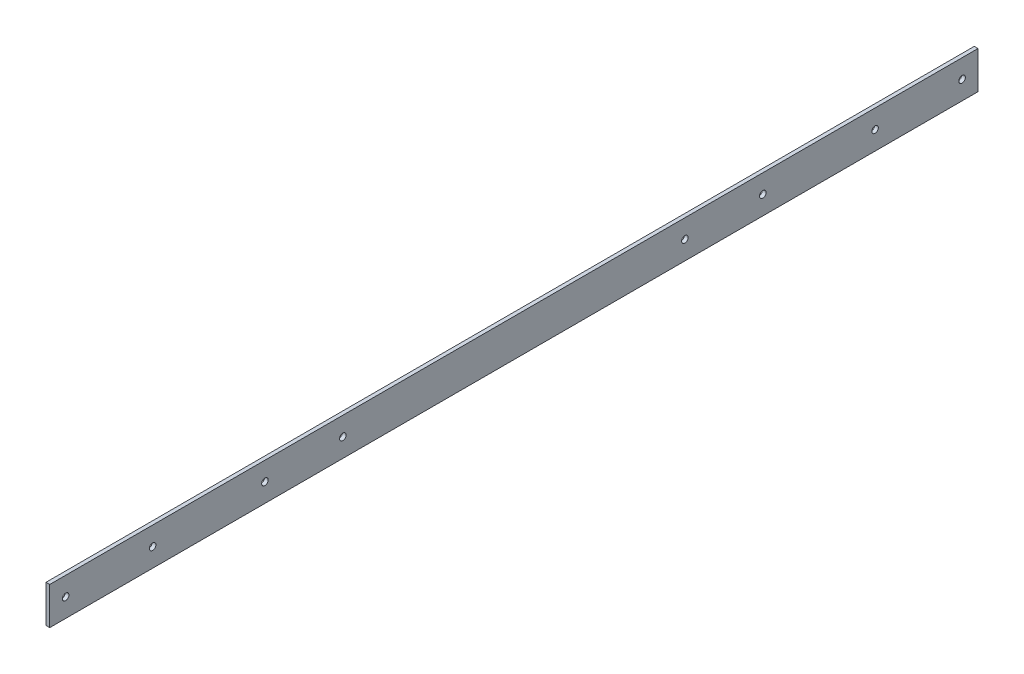
ISO-10303-21;
HEADER;
FILE_DESCRIPTION(('STEP AP214'),'2;1');
FILE_NAME('part.step','',(''),(''),'','','');
FILE_SCHEMA(('AUTOMOTIVE_DESIGN { 1 0 10303 214 1 1 1 1 }'));
ENDSEC;
DATA;
#1=APPLICATION_CONTEXT('core data for automotive mechanical design processes');
#2=APPLICATION_PROTOCOL_DEFINITION('international standard','automotive_design',2000,#1);
#3=PRODUCT_CONTEXT('',#1,'mechanical');
#4=PRODUCT('Part','Part','',(#3));
#5=PRODUCT_RELATED_PRODUCT_CATEGORY('part','',(#4));
#6=PRODUCT_DEFINITION_FORMATION('','',#4);
#7=PRODUCT_DEFINITION_CONTEXT('part definition',#1,'design');
#8=PRODUCT_DEFINITION('design','',#6,#7);
#9=PRODUCT_DEFINITION_SHAPE('','',#8);
#10=(LENGTH_UNIT() NAMED_UNIT(*) SI_UNIT(.MILLI.,.METRE.));
#11=(NAMED_UNIT(*) PLANE_ANGLE_UNIT() SI_UNIT($,.RADIAN.));
#12=(NAMED_UNIT(*) SI_UNIT($,.STERADIAN.) SOLID_ANGLE_UNIT());
#13=UNCERTAINTY_MEASURE_WITH_UNIT(LENGTH_MEASURE(1.E-05),#10,'distance_accuracy_value','');
#14=(GEOMETRIC_REPRESENTATION_CONTEXT(3) GLOBAL_UNCERTAINTY_ASSIGNED_CONTEXT((#13)) GLOBAL_UNIT_ASSIGNED_CONTEXT((#10,
#11,#12)) REPRESENTATION_CONTEXT('',''));
#15=CARTESIAN_POINT('',(0.,0.,0.));
#16=DIRECTION('',(0.,0.,1.));
#17=DIRECTION('',(1.,0.,0.));
#18=AXIS2_PLACEMENT_3D('',#15,#16,#17);
#19=CARTESIAN_POINT('',(0.,0.,496.));
#20=DIRECTION('',(1.,0.,0.));
#21=DIRECTION('',(0.,0.,-1.));
#22=AXIS2_PLACEMENT_3D('',#19,#20,#21);
#23=PLANE('',#22);
#24=CARTESIAN_POINT('',(0.,10.,55.));
#25=DIRECTION('',(-1.,0.,0.));
#26=DIRECTION('',(0.,0.,1.));
#27=AXIS2_PLACEMENT_3D('',#24,#25,#26);
#28=CIRCLE('',#27,1.74999999999998);
#29=CARTESIAN_POINT('',(0.,10.,56.75));
#30=VERTEX_POINT('',#29);
#31=EDGE_CURVE('E139',#30,#30,#28,.T.);
#32=ORIENTED_EDGE('',*,*,#31,.F.);
#33=EDGE_LOOP('',(#32));
#34=FACE_BOUND('',#33,.T.);
#35=CARTESIAN_POINT('',(0.,10.,114.99));
#36=DIRECTION('',(-1.,0.,0.));
#37=DIRECTION('',(0.,0.,1.));
#38=AXIS2_PLACEMENT_3D('',#35,#36,#37);
#39=CIRCLE('',#38,1.74999999999998);
#40=CARTESIAN_POINT('',(0.,10.,116.74));
#41=VERTEX_POINT('',#40);
#42=EDGE_CURVE('E151',#41,#41,#39,.T.);
#43=ORIENTED_EDGE('',*,*,#42,.F.);
#44=EDGE_LOOP('',(#43));
#45=FACE_BOUND('',#44,.T.);
#46=CARTESIAN_POINT('',(0.,10.,156.6));
#47=DIRECTION('',(-1.,0.,0.));
#48=DIRECTION('',(0.,0.,1.));
#49=AXIS2_PLACEMENT_3D('',#46,#47,#48);
#50=CIRCLE('',#49,1.74999999999998);
#51=CARTESIAN_POINT('',(0.,10.,158.35));
#52=VERTEX_POINT('',#51);
#53=EDGE_CURVE('E145',#52,#52,#50,.T.);
#54=ORIENTED_EDGE('',*,*,#53,.F.);
#55=EDGE_LOOP('',(#54));
#56=FACE_BOUND('',#55,.T.);
#57=CARTESIAN_POINT('',(0.,10.,8.50000000000001));
#58=DIRECTION('',(-1.,0.,0.));
#59=DIRECTION('',(0.,0.,1.));
#60=AXIS2_PLACEMENT_3D('',#57,#58,#59);
#61=CIRCLE('',#60,1.74999999999998);
#62=CARTESIAN_POINT('',(0.,10.,10.25));
#63=VERTEX_POINT('',#62);
#64=EDGE_CURVE('E122',#63,#63,#61,.T.);
#65=ORIENTED_EDGE('',*,*,#64,.F.);
#66=EDGE_LOOP('',(#65));
#67=FACE_BOUND('',#66,.T.);
#68=CARTESIAN_POINT('',(0.,10.,441.));
#69=DIRECTION('',(1.,0.,0.));
#70=DIRECTION('',(0.,0.,-1.));
#71=AXIS2_PLACEMENT_3D('',#68,#69,#70);
#72=CIRCLE('',#71,1.74999999999998);
#73=CARTESIAN_POINT('',(0.,10.,439.25));
#74=VERTEX_POINT('',#73);
#75=EDGE_CURVE('E115',#74,#74,#72,.T.);
#76=ORIENTED_EDGE('',*,*,#75,.T.);
#77=EDGE_LOOP('',(#76));
#78=FACE_BOUND('',#77,.T.);
#79=CARTESIAN_POINT('',(0.,10.,381.01));
#80=DIRECTION('',(1.,0.,0.));
#81=DIRECTION('',(0.,0.,-1.));
#82=AXIS2_PLACEMENT_3D('',#79,#80,#81);
#83=CIRCLE('',#82,1.74999999999998);
#84=CARTESIAN_POINT('',(0.,10.,379.26));
#85=VERTEX_POINT('',#84);
#86=EDGE_CURVE('E128',#85,#85,#83,.T.);
#87=ORIENTED_EDGE('',*,*,#86,.T.);
#88=EDGE_LOOP('',(#87));
#89=FACE_BOUND('',#88,.T.);
#90=CARTESIAN_POINT('',(0.,10.,339.4));
#91=DIRECTION('',(1.,0.,0.));
#92=DIRECTION('',(0.,0.,-1.));
#93=AXIS2_PLACEMENT_3D('',#90,#91,#92);
#94=CIRCLE('',#93,1.74999999999998);
#95=CARTESIAN_POINT('',(0.,10.,337.65));
#96=VERTEX_POINT('',#95);
#97=EDGE_CURVE('E121',#96,#96,#94,.T.);
#98=ORIENTED_EDGE('',*,*,#97,.T.);
#99=EDGE_LOOP('',(#98));
#100=FACE_BOUND('',#99,.T.);
#101=CARTESIAN_POINT('',(0.,10.,487.5));
#102=DIRECTION('',(1.,0.,0.));
#103=DIRECTION('',(0.,0.,-1.));
#104=AXIS2_PLACEMENT_3D('',#101,#102,#103);
#105=CIRCLE('',#104,1.74999999999998);
#106=CARTESIAN_POINT('',(0.,10.,485.75));
#107=VERTEX_POINT('',#106);
#108=EDGE_CURVE('E101',#107,#107,#105,.T.);
#109=ORIENTED_EDGE('',*,*,#108,.T.);
#110=EDGE_LOOP('',(#109));
#111=FACE_BOUND('',#110,.T.);
#112=DIRECTION('',(0.,-1.,0.));
#113=VECTOR('',#112,1.);
#114=CARTESIAN_POINT('',(0.,0.,0.));
#115=LINE('',#114,#113);
#116=CARTESIAN_POINT('',(0.,20.,0.));
#117=VERTEX_POINT('',#116);
#118=CARTESIAN_POINT('',(0.,0.,0.));
#119=VERTEX_POINT('',#118);
#120=EDGE_CURVE('E98',#117,#119,#115,.T.);
#121=ORIENTED_EDGE('',*,*,#120,.T.);
#122=DIRECTION('',(0.,0.,-1.));
#123=VECTOR('',#122,1.);
#124=CARTESIAN_POINT('',(0.,0.,496.));
#125=LINE('',#124,#123);
#126=CARTESIAN_POINT('',(0.,0.,496.));
#127=VERTEX_POINT('',#126);
#128=EDGE_CURVE('E11',#127,#119,#125,.T.);
#129=ORIENTED_EDGE('',*,*,#128,.F.);
#130=DIRECTION('',(0.,-1.,0.));
#131=VECTOR('',#130,1.);
#132=CARTESIAN_POINT('',(0.,0.,496.));
#133=LINE('',#132,#131);
#134=CARTESIAN_POINT('',(0.,20.,496.));
#135=VERTEX_POINT('',#134);
#136=EDGE_CURVE('E86',#135,#127,#133,.T.);
#137=ORIENTED_EDGE('',*,*,#136,.F.);
#138=DIRECTION('',(0.,0.,-1.));
#139=VECTOR('',#138,1.);
#140=CARTESIAN_POINT('',(0.,20.,496.));
#141=LINE('',#140,#139);
#142=EDGE_CURVE('E94',#135,#117,#141,.T.);
#143=ORIENTED_EDGE('',*,*,#142,.T.);
#144=EDGE_LOOP('',(#121,#129,#137,#143));
#145=FACE_BOUND('',#144,.T.);
#146=ADVANCED_FACE('F35',(#34,#45,#56,#67,#78,#89,#100,#111,#145),#23,.F.);
#147=CARTESIAN_POINT('',(0.,0.,496.));
#148=DIRECTION('',(0.,1.,0.));
#149=DIRECTION('',(0.,0.,1.));
#150=AXIS2_PLACEMENT_3D('',#147,#148,#149);
#151=PLANE('',#150);
#152=DIRECTION('',(1.,0.,0.));
#153=VECTOR('',#152,1.);
#154=CARTESIAN_POINT('',(0.,0.,0.));
#155=LINE('',#154,#153);
#156=CARTESIAN_POINT('',(2.,0.,0.));
#157=VERTEX_POINT('',#156);
#158=EDGE_CURVE('E90',#119,#157,#155,.T.);
#159=ORIENTED_EDGE('',*,*,#158,.T.);
#160=DIRECTION('',(0.,0.,-1.));
#161=VECTOR('',#160,1.);
#162=CARTESIAN_POINT('',(2.,0.,496.));
#163=LINE('',#162,#161);
#164=CARTESIAN_POINT('',(2.,0.,496.));
#165=VERTEX_POINT('',#164);
#166=EDGE_CURVE('E43',#165,#157,#163,.T.);
#167=ORIENTED_EDGE('',*,*,#166,.F.);
#168=DIRECTION('',(1.,0.,0.));
#169=VECTOR('',#168,1.);
#170=CARTESIAN_POINT('',(0.,0.,496.));
#171=LINE('',#170,#169);
#172=EDGE_CURVE('E81',#127,#165,#171,.T.);
#173=ORIENTED_EDGE('',*,*,#172,.F.);
#174=ORIENTED_EDGE('',*,*,#128,.T.);
#175=EDGE_LOOP('',(#159,#167,#173,#174));
#176=FACE_BOUND('',#175,.T.);
#177=ADVANCED_FACE('F89',(#176),#151,.F.);
#178=CARTESIAN_POINT('',(2.,0.,496.));
#179=DIRECTION('',(-1.,0.,0.));
#180=DIRECTION('',(0.,0.,1.));
#181=AXIS2_PLACEMENT_3D('',#178,#179,#180);
#182=PLANE('',#181);
#183=CARTESIAN_POINT('',(2.,10.,55.));
#184=DIRECTION('',(-1.,0.,0.));
#185=DIRECTION('',(0.,0.,1.));
#186=AXIS2_PLACEMENT_3D('',#183,#184,#185);
#187=CIRCLE('',#186,1.74999999999998);
#188=CARTESIAN_POINT('',(2.,10.,56.75));
#189=VERTEX_POINT('',#188);
#190=EDGE_CURVE('E154',#189,#189,#187,.T.);
#191=ORIENTED_EDGE('',*,*,#190,.T.);
#192=EDGE_LOOP('',(#191));
#193=FACE_BOUND('',#192,.T.);
#194=CARTESIAN_POINT('',(2.,10.,114.99));
#195=DIRECTION('',(-1.,0.,0.));
#196=DIRECTION('',(0.,0.,1.));
#197=AXIS2_PLACEMENT_3D('',#194,#195,#196);
#198=CIRCLE('',#197,1.74999999999998);
#199=CARTESIAN_POINT('',(2.,10.,116.74));
#200=VERTEX_POINT('',#199);
#201=EDGE_CURVE('E148',#200,#200,#198,.T.);
#202=ORIENTED_EDGE('',*,*,#201,.T.);
#203=EDGE_LOOP('',(#202));
#204=FACE_BOUND('',#203,.T.);
#205=CARTESIAN_POINT('',(2.,10.,156.6));
#206=DIRECTION('',(-1.,0.,0.));
#207=DIRECTION('',(0.,0.,1.));
#208=AXIS2_PLACEMENT_3D('',#205,#206,#207);
#209=CIRCLE('',#208,1.74999999999998);
#210=CARTESIAN_POINT('',(2.,10.,158.35));
#211=VERTEX_POINT('',#210);
#212=EDGE_CURVE('E142',#211,#211,#209,.T.);
#213=ORIENTED_EDGE('',*,*,#212,.T.);
#214=EDGE_LOOP('',(#213));
#215=FACE_BOUND('',#214,.T.);
#216=CARTESIAN_POINT('',(2.,10.,8.50000000000001));
#217=DIRECTION('',(-1.,0.,0.));
#218=DIRECTION('',(0.,0.,1.));
#219=AXIS2_PLACEMENT_3D('',#216,#217,#218);
#220=CIRCLE('',#219,1.74999999999998);
#221=CARTESIAN_POINT('',(2.,10.,10.25));
#222=VERTEX_POINT('',#221);
#223=EDGE_CURVE('E136',#222,#222,#220,.T.);
#224=ORIENTED_EDGE('',*,*,#223,.T.);
#225=EDGE_LOOP('',(#224));
#226=FACE_BOUND('',#225,.T.);
#227=CARTESIAN_POINT('',(2.,10.,441.));
#228=DIRECTION('',(1.,0.,0.));
#229=DIRECTION('',(0.,0.,-1.));
#230=AXIS2_PLACEMENT_3D('',#227,#228,#229);
#231=CIRCLE('',#230,1.74999999999998);
#232=CARTESIAN_POINT('',(2.,10.,439.25));
#233=VERTEX_POINT('',#232);
#234=EDGE_CURVE('E131',#233,#233,#231,.T.);
#235=ORIENTED_EDGE('',*,*,#234,.F.);
#236=EDGE_LOOP('',(#235));
#237=FACE_BOUND('',#236,.T.);
#238=CARTESIAN_POINT('',(2.,10.,381.01));
#239=DIRECTION('',(1.,0.,0.));
#240=DIRECTION('',(0.,0.,-1.));
#241=AXIS2_PLACEMENT_3D('',#238,#239,#240);
#242=CIRCLE('',#241,1.74999999999998);
#243=CARTESIAN_POINT('',(2.,10.,379.26));
#244=VERTEX_POINT('',#243);
#245=EDGE_CURVE('E125',#244,#244,#242,.T.);
#246=ORIENTED_EDGE('',*,*,#245,.F.);
#247=EDGE_LOOP('',(#246));
#248=FACE_BOUND('',#247,.T.);
#249=CARTESIAN_POINT('',(2.,10.,339.4));
#250=DIRECTION('',(1.,0.,0.));
#251=DIRECTION('',(0.,0.,-1.));
#252=AXIS2_PLACEMENT_3D('',#249,#250,#251);
#253=CIRCLE('',#252,1.74999999999998);
#254=CARTESIAN_POINT('',(2.,10.,337.65));
#255=VERTEX_POINT('',#254);
#256=EDGE_CURVE('E118',#255,#255,#253,.T.);
#257=ORIENTED_EDGE('',*,*,#256,.F.);
#258=EDGE_LOOP('',(#257));
#259=FACE_BOUND('',#258,.T.);
#260=CARTESIAN_POINT('',(2.,10.,487.5));
#261=DIRECTION('',(1.,0.,0.));
#262=DIRECTION('',(0.,0.,-1.));
#263=AXIS2_PLACEMENT_3D('',#260,#261,#262);
#264=CIRCLE('',#263,1.74999999999998);
#265=CARTESIAN_POINT('',(2.,10.,485.75));
#266=VERTEX_POINT('',#265);
#267=EDGE_CURVE('E112',#266,#266,#264,.T.);
#268=ORIENTED_EDGE('',*,*,#267,.F.);
#269=EDGE_LOOP('',(#268));
#270=FACE_BOUND('',#269,.T.);
#271=DIRECTION('',(0.,1.,0.));
#272=VECTOR('',#271,1.);
#273=CARTESIAN_POINT('',(2.,0.,0.));
#274=LINE('',#273,#272);
#275=CARTESIAN_POINT('',(2.,20.,0.));
#276=VERTEX_POINT('',#275);
#277=EDGE_CURVE('E68',#157,#276,#274,.T.);
#278=ORIENTED_EDGE('',*,*,#277,.T.);
#279=DIRECTION('',(0.,0.,-1.));
#280=VECTOR('',#279,1.);
#281=CARTESIAN_POINT('',(2.,20.,496.));
#282=LINE('',#281,#280);
#283=CARTESIAN_POINT('',(2.,20.,496.));
#284=VERTEX_POINT('',#283);
#285=EDGE_CURVE('E91',#284,#276,#282,.T.);
#286=ORIENTED_EDGE('',*,*,#285,.F.);
#287=DIRECTION('',(0.,1.,0.));
#288=VECTOR('',#287,1.);
#289=CARTESIAN_POINT('',(2.,0.,496.));
#290=LINE('',#289,#288);
#291=EDGE_CURVE('E84',#165,#284,#290,.T.);
#292=ORIENTED_EDGE('',*,*,#291,.F.);
#293=ORIENTED_EDGE('',*,*,#166,.T.);
#294=EDGE_LOOP('',(#278,#286,#292,#293));
#295=FACE_BOUND('',#294,.T.);
#296=ADVANCED_FACE('F92',(#193,#204,#215,#226,#237,#248,#259,#270,#295),#182,.F.);
#297=CARTESIAN_POINT('',(0.,20.,496.));
#298=DIRECTION('',(0.,-1.,0.));
#299=DIRECTION('',(0.,0.,-1.));
#300=AXIS2_PLACEMENT_3D('',#297,#298,#299);
#301=PLANE('',#300);
#302=DIRECTION('',(-1.,0.,0.));
#303=VECTOR('',#302,1.);
#304=CARTESIAN_POINT('',(0.,20.,0.));
#305=LINE('',#304,#303);
#306=EDGE_CURVE('E74',#276,#117,#305,.T.);
#307=ORIENTED_EDGE('',*,*,#306,.T.);
#308=ORIENTED_EDGE('',*,*,#142,.F.);
#309=DIRECTION('',(-1.,0.,0.));
#310=VECTOR('',#309,1.);
#311=CARTESIAN_POINT('',(0.,20.,496.));
#312=LINE('',#311,#310);
#313=EDGE_CURVE('E51',#284,#135,#312,.T.);
#314=ORIENTED_EDGE('',*,*,#313,.F.);
#315=ORIENTED_EDGE('',*,*,#285,.T.);
#316=EDGE_LOOP('',(#307,#308,#314,#315));
#317=FACE_BOUND('',#316,.T.);
#318=ADVANCED_FACE('F106',(#317),#301,.F.);
#319=CARTESIAN_POINT('',(0.,0.,496.));
#320=DIRECTION('',(0.,0.,-1.));
#321=DIRECTION('',(-1.,0.,0.));
#322=AXIS2_PLACEMENT_3D('',#319,#320,#321);
#323=PLANE('',#322);
#324=ORIENTED_EDGE('',*,*,#136,.T.);
#325=ORIENTED_EDGE('',*,*,#172,.T.);
#326=ORIENTED_EDGE('',*,*,#291,.T.);
#327=ORIENTED_EDGE('',*,*,#313,.T.);
#328=EDGE_LOOP('',(#324,#325,#326,#327));
#329=FACE_BOUND('',#328,.T.);
#330=ADVANCED_FACE('F82',(#329),#323,.F.);
#331=CARTESIAN_POINT('',(0.,0.,0.));
#332=DIRECTION('',(0.,0.,-1.));
#333=DIRECTION('',(-1.,0.,0.));
#334=AXIS2_PLACEMENT_3D('',#331,#332,#333);
#335=PLANE('',#334);
#336=ORIENTED_EDGE('',*,*,#120,.F.);
#337=ORIENTED_EDGE('',*,*,#306,.F.);
#338=ORIENTED_EDGE('',*,*,#277,.F.);
#339=ORIENTED_EDGE('',*,*,#158,.F.);
#340=EDGE_LOOP('',(#336,#337,#338,#339));
#341=FACE_BOUND('',#340,.T.);
#342=ADVANCED_FACE('F109',(#341),#335,.T.);
#343=CARTESIAN_POINT('',(0.,10.,487.5));
#344=DIRECTION('',(1.,0.,0.));
#345=DIRECTION('',(0.,0.,-1.));
#346=AXIS2_PLACEMENT_3D('',#343,#344,#345);
#347=CYLINDRICAL_SURFACE('',#346,1.74999999999998);
#348=ORIENTED_EDGE('',*,*,#108,.F.);
#349=EDGE_LOOP('',(#348));
#350=FACE_BOUND('',#349,.T.);
#351=ORIENTED_EDGE('',*,*,#267,.T.);
#352=EDGE_LOOP('',(#351));
#353=FACE_BOUND('',#352,.T.);
#354=ADVANCED_FACE('F179',(#350,#353),#347,.F.);
#355=CARTESIAN_POINT('',(0.,10.,339.4));
#356=DIRECTION('',(1.,0.,0.));
#357=DIRECTION('',(0.,0.,-1.));
#358=AXIS2_PLACEMENT_3D('',#355,#356,#357);
#359=CYLINDRICAL_SURFACE('',#358,1.74999999999998);
#360=ORIENTED_EDGE('',*,*,#97,.F.);
#361=EDGE_LOOP('',(#360));
#362=FACE_BOUND('',#361,.T.);
#363=ORIENTED_EDGE('',*,*,#256,.T.);
#364=EDGE_LOOP('',(#363));
#365=FACE_BOUND('',#364,.T.);
#366=ADVANCED_FACE('F182',(#362,#365),#359,.F.);
#367=CARTESIAN_POINT('',(0.,10.,381.01));
#368=DIRECTION('',(1.,0.,0.));
#369=DIRECTION('',(0.,0.,-1.));
#370=AXIS2_PLACEMENT_3D('',#367,#368,#369);
#371=CYLINDRICAL_SURFACE('',#370,1.74999999999998);
#372=ORIENTED_EDGE('',*,*,#86,.F.);
#373=EDGE_LOOP('',(#372));
#374=FACE_BOUND('',#373,.T.);
#375=ORIENTED_EDGE('',*,*,#245,.T.);
#376=EDGE_LOOP('',(#375));
#377=FACE_BOUND('',#376,.T.);
#378=ADVANCED_FACE('F202',(#374,#377),#371,.F.);
#379=CARTESIAN_POINT('',(0.,10.,441.));
#380=DIRECTION('',(1.,0.,0.));
#381=DIRECTION('',(0.,0.,-1.));
#382=AXIS2_PLACEMENT_3D('',#379,#380,#381);
#383=CYLINDRICAL_SURFACE('',#382,1.74999999999998);
#384=ORIENTED_EDGE('',*,*,#75,.F.);
#385=EDGE_LOOP('',(#384));
#386=FACE_BOUND('',#385,.T.);
#387=ORIENTED_EDGE('',*,*,#234,.T.);
#388=EDGE_LOOP('',(#387));
#389=FACE_BOUND('',#388,.T.);
#390=ADVANCED_FACE('F206',(#386,#389),#383,.F.);
#391=CARTESIAN_POINT('',(0.,10.,8.50000000000001));
#392=DIRECTION('',(1.,0.,0.));
#393=DIRECTION('',(0.,0.,-1.));
#394=AXIS2_PLACEMENT_3D('',#391,#392,#393);
#395=CYLINDRICAL_SURFACE('',#394,1.74999999999998);
#396=ORIENTED_EDGE('',*,*,#64,.T.);
#397=EDGE_LOOP('',(#396));
#398=FACE_BOUND('',#397,.T.);
#399=ORIENTED_EDGE('',*,*,#223,.F.);
#400=EDGE_LOOP('',(#399));
#401=FACE_BOUND('',#400,.T.);
#402=ADVANCED_FACE('F210',(#398,#401),#395,.F.);
#403=CARTESIAN_POINT('',(0.,10.,156.6));
#404=DIRECTION('',(1.,0.,0.));
#405=DIRECTION('',(0.,0.,-1.));
#406=AXIS2_PLACEMENT_3D('',#403,#404,#405);
#407=CYLINDRICAL_SURFACE('',#406,1.74999999999998);
#408=ORIENTED_EDGE('',*,*,#53,.T.);
#409=EDGE_LOOP('',(#408));
#410=FACE_BOUND('',#409,.T.);
#411=ORIENTED_EDGE('',*,*,#212,.F.);
#412=EDGE_LOOP('',(#411));
#413=FACE_BOUND('',#412,.T.);
#414=ADVANCED_FACE('F214',(#410,#413),#407,.F.);
#415=CARTESIAN_POINT('',(0.,10.,114.99));
#416=DIRECTION('',(1.,0.,0.));
#417=DIRECTION('',(0.,0.,-1.));
#418=AXIS2_PLACEMENT_3D('',#415,#416,#417);
#419=CYLINDRICAL_SURFACE('',#418,1.74999999999998);
#420=ORIENTED_EDGE('',*,*,#42,.T.);
#421=EDGE_LOOP('',(#420));
#422=FACE_BOUND('',#421,.T.);
#423=ORIENTED_EDGE('',*,*,#201,.F.);
#424=EDGE_LOOP('',(#423));
#425=FACE_BOUND('',#424,.T.);
#426=ADVANCED_FACE('F218',(#422,#425),#419,.F.);
#427=CARTESIAN_POINT('',(0.,10.,55.));
#428=DIRECTION('',(1.,0.,0.));
#429=DIRECTION('',(0.,0.,-1.));
#430=AXIS2_PLACEMENT_3D('',#427,#428,#429);
#431=CYLINDRICAL_SURFACE('',#430,1.74999999999998);
#432=ORIENTED_EDGE('',*,*,#31,.T.);
#433=EDGE_LOOP('',(#432));
#434=FACE_BOUND('',#433,.T.);
#435=ORIENTED_EDGE('',*,*,#190,.F.);
#436=EDGE_LOOP('',(#435));
#437=FACE_BOUND('',#436,.T.);
#438=ADVANCED_FACE('F160',(#434,#437),#431,.F.);
#439=CLOSED_SHELL('',(#146,#177,#296,#318,#330,#342,#354,#366,#378,#390,#402,#414,#426,#438));
#440=MANIFOLD_SOLID_BREP('B2',#439);
#441=ADVANCED_BREP_SHAPE_REPRESENTATION('',(#18,#440),#14);
#442=SHAPE_DEFINITION_REPRESENTATION(#9,#441);
ENDSEC;
END-ISO-10303-21;
